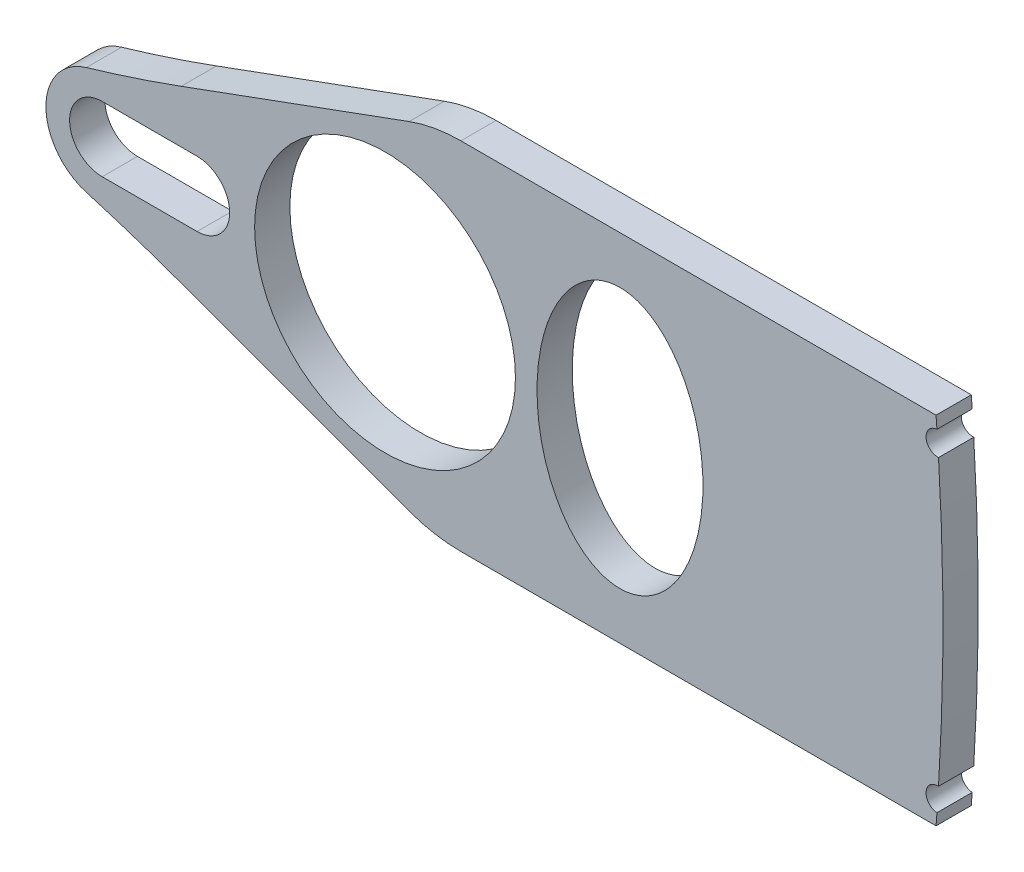
ISO-10303-21;
HEADER;
FILE_DESCRIPTION(('STEP AP214'),'2;1');
FILE_NAME('part.step','',(''),(''),'','','');
FILE_SCHEMA(('AUTOMOTIVE_DESIGN { 1 0 10303 214 1 1 1 1 }'));
ENDSEC;
DATA;
#1=APPLICATION_CONTEXT('core data for automotive mechanical design processes');
#2=APPLICATION_PROTOCOL_DEFINITION('international standard','automotive_design',2000,#1);
#3=PRODUCT_CONTEXT('',#1,'mechanical');
#4=PRODUCT('Part','Part','',(#3));
#5=PRODUCT_RELATED_PRODUCT_CATEGORY('part','',(#4));
#6=PRODUCT_DEFINITION_FORMATION('','',#4);
#7=PRODUCT_DEFINITION_CONTEXT('part definition',#1,'design');
#8=PRODUCT_DEFINITION('design','',#6,#7);
#9=PRODUCT_DEFINITION_SHAPE('','',#8);
#10=(LENGTH_UNIT() NAMED_UNIT(*) SI_UNIT(.MILLI.,.METRE.));
#11=(NAMED_UNIT(*) PLANE_ANGLE_UNIT() SI_UNIT($,.RADIAN.));
#12=(NAMED_UNIT(*) SI_UNIT($,.STERADIAN.) SOLID_ANGLE_UNIT());
#13=UNCERTAINTY_MEASURE_WITH_UNIT(LENGTH_MEASURE(1.E-05),#10,'distance_accuracy_value','');
#14=(GEOMETRIC_REPRESENTATION_CONTEXT(3) GLOBAL_UNCERTAINTY_ASSIGNED_CONTEXT((#13)) GLOBAL_UNIT_ASSIGNED_CONTEXT((#10,
#11,#12)) REPRESENTATION_CONTEXT('',''));
#15=CARTESIAN_POINT('',(0.,0.,0.));
#16=DIRECTION('',(0.,0.,1.));
#17=DIRECTION('',(1.,0.,0.));
#18=AXIS2_PLACEMENT_3D('',#15,#16,#17);
#19=CARTESIAN_POINT('',(-148.703303072536,-3.39173134022985E-11,3.));
#20=DIRECTION('',(0.,0.,1.));
#21=DIRECTION('',(1.,0.,0.));
#22=AXIS2_PLACEMENT_3D('',#19,#20,#21);
#23=PLANE('',#22);
#24=CARTESIAN_POINT('',(-0.545536149633069,0.,3.));
#25=DIRECTION('',(0.,0.,1.));
#26=DIRECTION('',(1.,0.,0.));
#27=AXIS2_PLACEMENT_3D('',#24,#25,#26);
#28=CIRCLE('',#27,11.101085899709);
#29=CARTESIAN_POINT('',(10.555549750076,0.,3.));
#30=VERTEX_POINT('',#29);
#31=EDGE_CURVE('E448',#30,#30,#28,.T.);
#32=ORIENTED_EDGE('',*,*,#31,.F.);
#33=EDGE_LOOP('',(#32));
#34=FACE_BOUND('',#33,.T.);
#35=DIRECTION('',(-1.,0.,0.));
#36=VECTOR('',#35,1.);
#37=CARTESIAN_POINT('',(28.8261972357437,15.1378444086942,3.));
#38=LINE('',#37,#36);
#39=CARTESIAN_POINT('',(46.3587127440423,15.1378444086954,3.));
#40=VERTEX_POINT('',#39);
#41=CARTESIAN_POINT('',(5.91044133032852,15.1378444086942,3.));
#42=VERTEX_POINT('',#41);
#43=EDGE_CURVE('E360',#40,#42,#38,.T.);
#44=ORIENTED_EDGE('',*,*,#43,.T.);
#45=CARTESIAN_POINT('',(5.9104413303358,2.32113614266628,3.));
#46=DIRECTION('',(0.,0.,1.));
#47=DIRECTION('',(1.,0.,0.));
#48=AXIS2_PLACEMENT_3D('',#45,#46,#47);
#49=CIRCLE('',#48,12.8167082660291);
#50=CARTESIAN_POINT('',(1.5045455670036,14.3567538376228,3.));
#51=VERTEX_POINT('',#50);
#52=EDGE_CURVE('E419',#42,#51,#49,.T.);
#53=ORIENTED_EDGE('',*,*,#52,.T.);
#54=DIRECTION('',(-0.939056850256716,-0.343761882683254,0.));
#55=VECTOR('',#54,1.);
#56=CARTESIAN_POINT('',(1.50454556700317,14.356753837624,3.));
#57=LINE('',#56,#55);
#58=CARTESIAN_POINT('',(-17.8942149727601,7.25542185431795,3.));
#59=VERTEX_POINT('',#58);
#60=EDGE_CURVE('E313',#51,#59,#57,.T.);
#61=ORIENTED_EDGE('',*,*,#60,.T.);
#62=CARTESIAN_POINT('',(-61.9531726061157,127.611598803856,3.));
#63=DIRECTION('',(0.,0.,-1.));
#64=DIRECTION('',(1.,0.,0.));
#65=AXIS2_PLACEMENT_3D('',#62,#63,#64);
#66=CIRCLE('',#65,128.167082660276);
#67=CARTESIAN_POINT('',(-25.9650650638667,4.60079767983473,3.));
#68=VERTEX_POINT('',#67);
#69=EDGE_CURVE('E409',#59,#68,#66,.T.);
#70=ORIENTED_EDGE('',*,*,#69,.T.);
#71=CARTESIAN_POINT('',(-24.6190531676033,-2.67272537154353E-12,3.));
#72=DIRECTION('',(0.,0.,1.));
#73=DIRECTION('',(1.,0.,0.));
#74=AXIS2_PLACEMENT_3D('',#71,#72,#73);
#75=CIRCLE('',#74,4.79365072941982);
#76=CARTESIAN_POINT('',(-25.9650650638678,-4.60079767983837,3.));
#77=VERTEX_POINT('',#76);
#78=EDGE_CURVE('E413',#68,#77,#75,.T.);
#79=ORIENTED_EDGE('',*,*,#78,.T.);
#80=CARTESIAN_POINT('',(-61.953172606039,-127.611598803884,3.));
#81=DIRECTION('',(0.,0.,-1.));
#82=DIRECTION('',(1.,0.,0.));
#83=AXIS2_PLACEMENT_3D('',#80,#81,#82);
#84=CIRCLE('',#83,128.167082660278);
#85=CARTESIAN_POINT('',(-17.8942149727582,-7.25542185431699,3.));
#86=VERTEX_POINT('',#85);
#87=EDGE_CURVE('E417',#77,#86,#84,.T.);
#88=ORIENTED_EDGE('',*,*,#87,.T.);
#89=DIRECTION('',(0.939056850256712,-0.343761882683264,0.));
#90=VECTOR('',#89,1.);
#91=CARTESIAN_POINT('',(-17.8942149727587,-7.25542185431823,3.));
#92=LINE('',#91,#90);
#93=CARTESIAN_POINT('',(1.50454556699025,-14.3567538376193,3.));
#94=VERTEX_POINT('',#93);
#95=EDGE_CURVE('E425',#86,#94,#92,.T.);
#96=ORIENTED_EDGE('',*,*,#95,.T.);
#97=CARTESIAN_POINT('',(5.91044133032117,-2.3211361426666,3.));
#98=DIRECTION('',(0.,0.,1.));
#99=DIRECTION('',(1.,0.,0.));
#100=AXIS2_PLACEMENT_3D('',#97,#98,#99);
#101=CIRCLE('',#100,12.8167082660263);
#102=CARTESIAN_POINT('',(5.91044133032854,-15.1378444086929,3.));
#103=VERTEX_POINT('',#102);
#104=EDGE_CURVE('E428',#94,#103,#101,.T.);
#105=ORIENTED_EDGE('',*,*,#104,.T.);
#106=DIRECTION('',(1.,0.,0.));
#107=VECTOR('',#106,1.);
#108=CARTESIAN_POINT('',(5.91044133032854,-15.1378444086942,3.));
#109=LINE('',#108,#107);
#110=CARTESIAN_POINT('',(46.3587127440441,-15.1378444086928,3.));
#111=VERTEX_POINT('',#110);
#112=EDGE_CURVE('E431',#103,#111,#109,.T.);
#113=ORIENTED_EDGE('',*,*,#112,.T.);
#114=CARTESIAN_POINT('',(-148.703303072536,1.32348559195306E-12,3.));
#115=DIRECTION('',(0.,0.,1.));
#116=DIRECTION('',(1.,0.,0.));
#117=AXIS2_PLACEMENT_3D('',#114,#115,#116);
#118=CIRCLE('',#117,195.64852247786);
#119=CARTESIAN_POINT('',(46.4342016571532,-14.131475352561,3.));
#120=VERTEX_POINT('',#119);
#121=EDGE_CURVE('E434',#111,#120,#118,.T.);
#122=ORIENTED_EDGE('',*,*,#121,.T.);
#123=CARTESIAN_POINT('',(46.5148800931519,-13.125515764054,3.));
#124=DIRECTION('',(0.,0.,-1.));
#125=DIRECTION('',(1.,0.,0.));
#126=AXIS2_PLACEMENT_3D('',#123,#124,#125);
#127=CIRCLE('',#126,1.00918962724761);
#128=CARTESIAN_POINT('',(46.5695906510489,-12.1178102224404,3.));
#129=VERTEX_POINT('',#128);
#130=EDGE_CURVE('E437',#120,#129,#127,.T.);
#131=ORIENTED_EDGE('',*,*,#130,.T.);
#132=CARTESIAN_POINT('',(-148.703303072536,-1.28011750505364E-12,3.));
#133=DIRECTION('',(0.,0.,1.));
#134=DIRECTION('',(1.,0.,0.));
#135=AXIS2_PLACEMENT_3D('',#132,#133,#134);
#136=CIRCLE('',#135,195.64852247786);
#137=CARTESIAN_POINT('',(46.5695906510489,12.1178102224377,3.));
#138=VERTEX_POINT('',#137);
#139=EDGE_CURVE('E440',#129,#138,#136,.T.);
#140=ORIENTED_EDGE('',*,*,#139,.T.);
#141=CARTESIAN_POINT('',(46.5148800931719,13.1255157640552,3.));
#142=DIRECTION('',(0.,0.,-1.));
#143=DIRECTION('',(1.,0.,0.));
#144=AXIS2_PLACEMENT_3D('',#141,#142,#143);
#145=CIRCLE('',#144,1.00918962725036);
#146=CARTESIAN_POINT('',(46.4342016571542,14.1314753525285,3.));
#147=VERTEX_POINT('',#146);
#148=EDGE_CURVE('E443',#138,#147,#145,.T.);
#149=ORIENTED_EDGE('',*,*,#148,.T.);
#150=CARTESIAN_POINT('',(-148.703303072536,-3.39173134022985E-11,3.));
#151=DIRECTION('',(0.,0.,1.));
#152=DIRECTION('',(1.,0.,0.));
#153=AXIS2_PLACEMENT_3D('',#150,#151,#152);
#154=CIRCLE('',#153,195.648522477861);
#155=EDGE_CURVE('E366',#147,#40,#154,.T.);
#156=ORIENTED_EDGE('',*,*,#155,.T.);
#157=EDGE_LOOP('',(#44,#53,#61,#70,#79,#88,#96,#105,#113,#122,#131,#140,#149,#156));
#158=FACE_BOUND('',#157,.T.);
#159=CARTESIAN_POINT('',(19.4544638503669,0.,3.));
#160=DIRECTION('',(0.,0.,1.));
#161=DIRECTION('',(0.,-1.,0.));
#162=AXIS2_PLACEMENT_3D('',#159,#160,#161);
#163=ELLIPSE('',#162,11.101085899709,7.06432739072393);
#164=CARTESIAN_POINT('',(19.454463850367,-11.1010858997089,3.));
#165=VERTEX_POINT('',#164);
#166=EDGE_CURVE('E219',#165,#165,#163,.T.);
#167=ORIENTED_EDGE('',*,*,#166,.F.);
#168=EDGE_LOOP('',(#167));
#169=FACE_BOUND('',#168,.T.);
#170=DIRECTION('',(-1.,0.,0.));
#171=VECTOR('',#170,1.);
#172=CARTESIAN_POINT('',(-24.6190531676033,2.77527147492737,3.));
#173=LINE('',#172,#171);
#174=CARTESIAN_POINT('',(-16.5455361496331,2.77527147492737,3.));
#175=VERTEX_POINT('',#174);
#176=CARTESIAN_POINT('',(-24.6190531676033,2.77527147492735,3.));
#177=VERTEX_POINT('',#176);
#178=EDGE_CURVE('E180',#175,#177,#173,.T.);
#179=ORIENTED_EDGE('',*,*,#178,.F.);
#180=CARTESIAN_POINT('',(-16.5455361496331,1.10154940724527E-13,3.));
#181=DIRECTION('',(0.,0.,1.));
#182=DIRECTION('',(1.,0.,0.));
#183=AXIS2_PLACEMENT_3D('',#180,#181,#182);
#184=CIRCLE('',#183,2.77527147492728);
#185=CARTESIAN_POINT('',(-16.5455361496331,-2.7752714749272,3.));
#186=VERTEX_POINT('',#185);
#187=EDGE_CURVE('E171',#186,#175,#184,.T.);
#188=ORIENTED_EDGE('',*,*,#187,.F.);
#189=DIRECTION('',(1.,0.,0.));
#190=VECTOR('',#189,1.);
#191=CARTESIAN_POINT('',(-16.5455361496331,-2.7752714749272,3.));
#192=LINE('',#191,#190);
#193=CARTESIAN_POINT('',(-24.6190531676033,-2.7752714749272,3.));
#194=VERTEX_POINT('',#193);
#195=EDGE_CURVE('E197',#194,#186,#192,.T.);
#196=ORIENTED_EDGE('',*,*,#195,.F.);
#197=CARTESIAN_POINT('',(-24.6190531676033,0.,3.));
#198=DIRECTION('',(0.,0.,1.));
#199=DIRECTION('',(1.,0.,0.));
#200=AXIS2_PLACEMENT_3D('',#197,#198,#199);
#201=CIRCLE('',#200,2.77527147492728);
#202=EDGE_CURVE('E193',#177,#194,#201,.T.);
#203=ORIENTED_EDGE('',*,*,#202,.F.);
#204=EDGE_LOOP('',(#179,#188,#196,#203));
#205=FACE_BOUND('',#204,.T.);
#206=ADVANCED_FACE('F45',(#34,#158,#169,#205),#23,.T.);
#207=CARTESIAN_POINT('',(-148.703303072536,-3.39173134022985E-11,0.));
#208=DIRECTION('',(0.,0.,1.));
#209=DIRECTION('',(1.,0.,0.));
#210=AXIS2_PLACEMENT_3D('',#207,#208,#209);
#211=PLANE('',#210);
#212=CARTESIAN_POINT('',(19.4544638503669,0.,0.));
#213=DIRECTION('',(0.,0.,1.));
#214=DIRECTION('',(0.,-1.,0.));
#215=AXIS2_PLACEMENT_3D('',#212,#213,#214);
#216=ELLIPSE('',#215,11.101085899709,7.06432739072393);
#217=CARTESIAN_POINT('',(19.454463850367,-11.1010858997089,0.));
#218=VERTEX_POINT('',#217);
#219=EDGE_CURVE('E189',#218,#218,#216,.T.);
#220=ORIENTED_EDGE('',*,*,#219,.T.);
#221=EDGE_LOOP('',(#220));
#222=FACE_BOUND('',#221,.T.);
#223=CARTESIAN_POINT('',(-0.545536149633069,0.,0.));
#224=DIRECTION('',(0.,0.,1.));
#225=DIRECTION('',(1.,0.,0.));
#226=AXIS2_PLACEMENT_3D('',#223,#224,#225);
#227=CIRCLE('',#226,11.101085899709);
#228=CARTESIAN_POINT('',(10.555549750076,0.,0.));
#229=VERTEX_POINT('',#228);
#230=EDGE_CURVE('E224',#229,#229,#227,.T.);
#231=ORIENTED_EDGE('',*,*,#230,.T.);
#232=EDGE_LOOP('',(#231));
#233=FACE_BOUND('',#232,.T.);
#234=DIRECTION('',(-1.,0.,0.));
#235=VECTOR('',#234,1.);
#236=CARTESIAN_POINT('',(28.8261972357437,15.1378444086942,0.));
#237=LINE('',#236,#235);
#238=CARTESIAN_POINT('',(46.3587127440423,15.1378444086954,0.));
#239=VERTEX_POINT('',#238);
#240=CARTESIAN_POINT('',(5.91044133032852,15.1378444086942,0.));
#241=VERTEX_POINT('',#240);
#242=EDGE_CURVE('E309',#239,#241,#237,.T.);
#243=ORIENTED_EDGE('',*,*,#242,.F.);
#244=CARTESIAN_POINT('',(-148.703303072536,-3.39173134022985E-11,0.));
#245=DIRECTION('',(0.,0.,1.));
#246=DIRECTION('',(1.,0.,0.));
#247=AXIS2_PLACEMENT_3D('',#244,#245,#246);
#248=CIRCLE('',#247,195.648522477861);
#249=CARTESIAN_POINT('',(46.4342016571542,14.1314753525285,0.));
#250=VERTEX_POINT('',#249);
#251=EDGE_CURVE('E356',#250,#239,#248,.T.);
#252=ORIENTED_EDGE('',*,*,#251,.F.);
#253=CARTESIAN_POINT('',(46.5148800931626,13.1255157640223,0.));
#254=DIRECTION('',(0.,0.,-1.));
#255=DIRECTION('',(1.,0.,0.));
#256=AXIS2_PLACEMENT_3D('',#253,#254,#255);
#257=CIRCLE('',#256,1.00918962724769);
#258=CARTESIAN_POINT('',(46.5695906510489,12.1178102224377,0.));
#259=VERTEX_POINT('',#258);
#260=EDGE_CURVE('E353',#259,#250,#257,.T.);
#261=ORIENTED_EDGE('',*,*,#260,.F.);
#262=CARTESIAN_POINT('',(-148.703303072536,-1.28011750505364E-12,0.));
#263=DIRECTION('',(0.,0.,1.));
#264=DIRECTION('',(1.,0.,0.));
#265=AXIS2_PLACEMENT_3D('',#262,#263,#264);
#266=CIRCLE('',#265,195.64852247786);
#267=CARTESIAN_POINT('',(46.5695906510489,-12.1178102224404,0.));
#268=VERTEX_POINT('',#267);
#269=EDGE_CURVE('E349',#268,#259,#266,.T.);
#270=ORIENTED_EDGE('',*,*,#269,.F.);
#271=CARTESIAN_POINT('',(46.5148800931519,-13.125515764054,0.));
#272=DIRECTION('',(0.,0.,-1.));
#273=DIRECTION('',(1.,0.,0.));
#274=AXIS2_PLACEMENT_3D('',#271,#272,#273);
#275=CIRCLE('',#274,1.00918962724762);
#276=CARTESIAN_POINT('',(46.4342016571532,-14.131475352561,0.));
#277=VERTEX_POINT('',#276);
#278=EDGE_CURVE('E346',#277,#268,#275,.T.);
#279=ORIENTED_EDGE('',*,*,#278,.F.);
#280=CARTESIAN_POINT('',(-148.703303072536,1.32348559195306E-12,0.));
#281=DIRECTION('',(0.,0.,1.));
#282=DIRECTION('',(1.,0.,0.));
#283=AXIS2_PLACEMENT_3D('',#280,#281,#282);
#284=CIRCLE('',#283,195.64852247786);
#285=CARTESIAN_POINT('',(46.3587127440441,-15.1378444086928,0.));
#286=VERTEX_POINT('',#285);
#287=EDGE_CURVE('E342',#286,#277,#284,.T.);
#288=ORIENTED_EDGE('',*,*,#287,.F.);
#289=DIRECTION('',(1.,0.,0.));
#290=VECTOR('',#289,1.);
#291=CARTESIAN_POINT('',(28.8261972357436,-15.1378444086942,0.));
#292=LINE('',#291,#290);
#293=CARTESIAN_POINT('',(5.91044133032854,-15.1378444086929,0.));
#294=VERTEX_POINT('',#293);
#295=EDGE_CURVE('E339',#294,#286,#292,.T.);
#296=ORIENTED_EDGE('',*,*,#295,.F.);
#297=CARTESIAN_POINT('',(5.91044133032117,-2.3211361426666,0.));
#298=DIRECTION('',(0.,0.,1.));
#299=DIRECTION('',(1.,0.,0.));
#300=AXIS2_PLACEMENT_3D('',#297,#298,#299);
#301=CIRCLE('',#300,12.8167082660263);
#302=CARTESIAN_POINT('',(1.50454556699025,-14.3567538376193,0.));
#303=VERTEX_POINT('',#302);
#304=EDGE_CURVE('E335',#303,#294,#301,.T.);
#305=ORIENTED_EDGE('',*,*,#304,.F.);
#306=DIRECTION('',(0.939056850256712,-0.343761882683264,0.));
#307=VECTOR('',#306,1.);
#308=CARTESIAN_POINT('',(-17.8942149727587,-7.25542185431823,0.));
#309=LINE('',#308,#307);
#310=CARTESIAN_POINT('',(-17.8942149727582,-7.25542185431699,0.));
#311=VERTEX_POINT('',#310);
#312=EDGE_CURVE('E332',#311,#303,#309,.T.);
#313=ORIENTED_EDGE('',*,*,#312,.F.);
#314=CARTESIAN_POINT('',(-61.953172606039,-127.611598803884,0.));
#315=DIRECTION('',(0.,0.,-1.));
#316=DIRECTION('',(1.,0.,0.));
#317=AXIS2_PLACEMENT_3D('',#314,#315,#316);
#318=CIRCLE('',#317,128.167082660278);
#319=CARTESIAN_POINT('',(-25.9650650638678,-4.60079767983837,0.));
#320=VERTEX_POINT('',#319);
#321=EDGE_CURVE('E329',#320,#311,#318,.T.);
#322=ORIENTED_EDGE('',*,*,#321,.F.);
#323=CARTESIAN_POINT('',(-24.6190531676033,-2.67272537154353E-12,0.));
#324=DIRECTION('',(0.,0.,1.));
#325=DIRECTION('',(1.,0.,0.));
#326=AXIS2_PLACEMENT_3D('',#323,#324,#325);
#327=CIRCLE('',#326,4.79365072941982);
#328=CARTESIAN_POINT('',(-25.9650650638667,4.60079767983473,0.));
#329=VERTEX_POINT('',#328);
#330=EDGE_CURVE('E323',#329,#320,#327,.T.);
#331=ORIENTED_EDGE('',*,*,#330,.F.);
#332=CARTESIAN_POINT('',(-61.9531726061157,127.611598803856,0.));
#333=DIRECTION('',(0.,0.,-1.));
#334=DIRECTION('',(1.,0.,0.));
#335=AXIS2_PLACEMENT_3D('',#332,#333,#334);
#336=CIRCLE('',#335,128.167082660276);
#337=CARTESIAN_POINT('',(-17.8942149727601,7.25542185431795,0.));
#338=VERTEX_POINT('',#337);
#339=EDGE_CURVE('E319',#338,#329,#336,.T.);
#340=ORIENTED_EDGE('',*,*,#339,.F.);
#341=DIRECTION('',(-0.939056850256716,-0.343761882683254,0.));
#342=VECTOR('',#341,1.);
#343=CARTESIAN_POINT('',(1.50454556700317,14.356753837624,0.));
#344=LINE('',#343,#342);
#345=CARTESIAN_POINT('',(1.5045455670036,14.3567538376228,0.));
#346=VERTEX_POINT('',#345);
#347=EDGE_CURVE('E308',#346,#338,#344,.T.);
#348=ORIENTED_EDGE('',*,*,#347,.F.);
#349=CARTESIAN_POINT('',(5.9104413303358,2.32113614266628,0.));
#350=DIRECTION('',(0.,0.,1.));
#351=DIRECTION('',(1.,0.,0.));
#352=AXIS2_PLACEMENT_3D('',#349,#350,#351);
#353=CIRCLE('',#352,12.8167082660291);
#354=EDGE_CURVE('E300',#241,#346,#353,.T.);
#355=ORIENTED_EDGE('',*,*,#354,.F.);
#356=EDGE_LOOP('',(#243,#252,#261,#270,#279,#288,#296,#305,#313,#322,#331,#340,#348,#355));
#357=FACE_BOUND('',#356,.T.);
#358=CARTESIAN_POINT('',(-16.5455361496331,1.10154940724527E-13,0.));
#359=DIRECTION('',(0.,0.,1.));
#360=DIRECTION('',(1.,0.,0.));
#361=AXIS2_PLACEMENT_3D('',#358,#359,#360);
#362=CIRCLE('',#361,2.77527147492728);
#363=CARTESIAN_POINT('',(-16.5455361496331,-2.7752714749272,0.));
#364=VERTEX_POINT('',#363);
#365=CARTESIAN_POINT('',(-16.5455361496331,2.77527147492737,0.));
#366=VERTEX_POINT('',#365);
#367=EDGE_CURVE('E69',#364,#366,#362,.T.);
#368=ORIENTED_EDGE('',*,*,#367,.T.);
#369=DIRECTION('',(-1.,0.,0.));
#370=VECTOR('',#369,1.);
#371=CARTESIAN_POINT('',(-24.6190531676033,2.77527147492737,0.));
#372=LINE('',#371,#370);
#373=CARTESIAN_POINT('',(-24.6190531676033,2.77527147492735,0.));
#374=VERTEX_POINT('',#373);
#375=EDGE_CURVE('E187',#366,#374,#372,.T.);
#376=ORIENTED_EDGE('',*,*,#375,.T.);
#377=CARTESIAN_POINT('',(-24.6190531676033,0.,0.));
#378=DIRECTION('',(0.,0.,1.));
#379=DIRECTION('',(1.,0.,0.));
#380=AXIS2_PLACEMENT_3D('',#377,#378,#379);
#381=CIRCLE('',#380,2.77527147492728);
#382=CARTESIAN_POINT('',(-24.6190531676033,-2.7752714749272,0.));
#383=VERTEX_POINT('',#382);
#384=EDGE_CURVE('E206',#374,#383,#381,.T.);
#385=ORIENTED_EDGE('',*,*,#384,.T.);
#386=DIRECTION('',(1.,0.,0.));
#387=VECTOR('',#386,1.);
#388=CARTESIAN_POINT('',(-16.5455361496331,-2.7752714749272,0.));
#389=LINE('',#388,#387);
#390=EDGE_CURVE('E181',#383,#364,#389,.T.);
#391=ORIENTED_EDGE('',*,*,#390,.T.);
#392=EDGE_LOOP('',(#368,#376,#385,#391));
#393=FACE_BOUND('',#392,.T.);
#394=ADVANCED_FACE('F240',(#222,#233,#357,#393),#211,.F.);
#395=CARTESIAN_POINT('',(28.8261972357437,15.1378444086942,3.));
#396=DIRECTION('',(0.,-1.,0.));
#397=DIRECTION('',(0.,0.,-1.));
#398=AXIS2_PLACEMENT_3D('',#395,#396,#397);
#399=PLANE('',#398);
#400=ORIENTED_EDGE('',*,*,#242,.T.);
#401=DIRECTION('',(0.,0.,-1.));
#402=VECTOR('',#401,1.);
#403=CARTESIAN_POINT('',(5.91044133032852,15.1378444086942,3.));
#404=LINE('',#403,#402);
#405=EDGE_CURVE('E11',#42,#241,#404,.T.);
#406=ORIENTED_EDGE('',*,*,#405,.F.);
#407=ORIENTED_EDGE('',*,*,#43,.F.);
#408=DIRECTION('',(0.,0.,-1.));
#409=VECTOR('',#408,1.);
#410=CARTESIAN_POINT('',(46.3587127440423,15.1378444086954,3.));
#411=LINE('',#410,#409);
#412=EDGE_CURVE('E361',#40,#239,#411,.T.);
#413=ORIENTED_EDGE('',*,*,#412,.T.);
#414=EDGE_LOOP('',(#400,#406,#407,#413));
#415=FACE_BOUND('',#414,.T.);
#416=ADVANCED_FACE('F47',(#415),#399,.F.);
#417=CARTESIAN_POINT('',(5.9104413303358,2.32113614266628,3.));
#418=DIRECTION('',(0.,0.,-1.));
#419=DIRECTION('',(-1.,0.,0.));
#420=AXIS2_PLACEMENT_3D('',#417,#418,#419);
#421=CYLINDRICAL_SURFACE('',#420,12.8167082660291);
#422=ORIENTED_EDGE('',*,*,#354,.T.);
#423=DIRECTION('',(0.,0.,-1.));
#424=VECTOR('',#423,1.);
#425=CARTESIAN_POINT('',(1.5045455670036,14.3567538376228,3.));
#426=LINE('',#425,#424);
#427=EDGE_CURVE('E54',#51,#346,#426,.T.);
#428=ORIENTED_EDGE('',*,*,#427,.F.);
#429=ORIENTED_EDGE('',*,*,#52,.F.);
#430=ORIENTED_EDGE('',*,*,#405,.T.);
#431=EDGE_LOOP('',(#422,#428,#429,#430));
#432=FACE_BOUND('',#431,.T.);
#433=ADVANCED_FACE('F290',(#432),#421,.T.);
#434=CARTESIAN_POINT('',(1.50454556700317,14.356753837624,3.));
#435=DIRECTION('',(0.343761882683254,-0.939056850256716,0.));
#436=DIRECTION('',(0.939056850256716,0.343761882683254,0.));
#437=AXIS2_PLACEMENT_3D('',#434,#435,#436);
#438=PLANE('',#437);
#439=ORIENTED_EDGE('',*,*,#347,.T.);
#440=DIRECTION('',(0.,0.,-1.));
#441=VECTOR('',#440,1.);
#442=CARTESIAN_POINT('',(-17.8942149727601,7.25542185431795,3.));
#443=LINE('',#442,#441);
#444=EDGE_CURVE('E315',#59,#338,#443,.T.);
#445=ORIENTED_EDGE('',*,*,#444,.F.);
#446=ORIENTED_EDGE('',*,*,#60,.F.);
#447=ORIENTED_EDGE('',*,*,#427,.T.);
#448=EDGE_LOOP('',(#439,#445,#446,#447));
#449=FACE_BOUND('',#448,.T.);
#450=ADVANCED_FACE('F287',(#449),#438,.F.);
#451=CARTESIAN_POINT('',(-61.9531726061157,127.611598803856,3.));
#452=DIRECTION('',(0.,0.,-1.));
#453=DIRECTION('',(-1.,0.,0.));
#454=AXIS2_PLACEMENT_3D('',#451,#452,#453);
#455=CYLINDRICAL_SURFACE('',#454,128.167082660276);
#456=ORIENTED_EDGE('',*,*,#339,.T.);
#457=DIRECTION('',(0.,0.,-1.));
#458=VECTOR('',#457,1.);
#459=CARTESIAN_POINT('',(-25.9650650638667,4.60079767983473,3.));
#460=LINE('',#459,#458);
#461=EDGE_CURVE('E402',#68,#329,#460,.T.);
#462=ORIENTED_EDGE('',*,*,#461,.F.);
#463=ORIENTED_EDGE('',*,*,#69,.F.);
#464=ORIENTED_EDGE('',*,*,#444,.T.);
#465=EDGE_LOOP('',(#456,#462,#463,#464));
#466=FACE_BOUND('',#465,.T.);
#467=ADVANCED_FACE('F283',(#466),#455,.F.);
#468=CARTESIAN_POINT('',(-24.6190531676033,-2.67272537154353E-12,3.));
#469=DIRECTION('',(0.,0.,-1.));
#470=DIRECTION('',(-1.,0.,0.));
#471=AXIS2_PLACEMENT_3D('',#468,#469,#470);
#472=CYLINDRICAL_SURFACE('',#471,4.79365072941982);
#473=ORIENTED_EDGE('',*,*,#330,.T.);
#474=DIRECTION('',(0.,0.,-1.));
#475=VECTOR('',#474,1.);
#476=CARTESIAN_POINT('',(-25.9650650638678,-4.60079767983837,3.));
#477=LINE('',#476,#475);
#478=EDGE_CURVE('E398',#77,#320,#477,.T.);
#479=ORIENTED_EDGE('',*,*,#478,.F.);
#480=ORIENTED_EDGE('',*,*,#78,.F.);
#481=ORIENTED_EDGE('',*,*,#461,.T.);
#482=EDGE_LOOP('',(#473,#479,#480,#481));
#483=FACE_BOUND('',#482,.T.);
#484=ADVANCED_FACE('F279',(#483),#472,.T.);
#485=CARTESIAN_POINT('',(-61.953172606039,-127.611598803884,3.));
#486=DIRECTION('',(0.,0.,-1.));
#487=DIRECTION('',(-1.,0.,0.));
#488=AXIS2_PLACEMENT_3D('',#485,#486,#487);
#489=CYLINDRICAL_SURFACE('',#488,128.167082660278);
#490=ORIENTED_EDGE('',*,*,#321,.T.);
#491=DIRECTION('',(0.,0.,-1.));
#492=VECTOR('',#491,1.);
#493=CARTESIAN_POINT('',(-17.8942149727582,-7.25542185431699,3.));
#494=LINE('',#493,#492);
#495=EDGE_CURVE('E394',#86,#311,#494,.T.);
#496=ORIENTED_EDGE('',*,*,#495,.F.);
#497=ORIENTED_EDGE('',*,*,#87,.F.);
#498=ORIENTED_EDGE('',*,*,#478,.T.);
#499=EDGE_LOOP('',(#490,#496,#497,#498));
#500=FACE_BOUND('',#499,.T.);
#501=ADVANCED_FACE('F275',(#500),#489,.F.);
#502=CARTESIAN_POINT('',(-17.8942149727587,-7.25542185431823,3.));
#503=DIRECTION('',(0.343761882683264,0.939056850256712,0.));
#504=DIRECTION('',(-0.939056850256713,0.343761882683264,0.));
#505=AXIS2_PLACEMENT_3D('',#502,#503,#504);
#506=PLANE('',#505);
#507=ORIENTED_EDGE('',*,*,#312,.T.);
#508=DIRECTION('',(0.,0.,-1.));
#509=VECTOR('',#508,1.);
#510=CARTESIAN_POINT('',(1.50454556699025,-14.3567538376193,3.));
#511=LINE('',#510,#509);
#512=EDGE_CURVE('E390',#94,#303,#511,.T.);
#513=ORIENTED_EDGE('',*,*,#512,.F.);
#514=ORIENTED_EDGE('',*,*,#95,.F.);
#515=ORIENTED_EDGE('',*,*,#495,.T.);
#516=EDGE_LOOP('',(#507,#513,#514,#515));
#517=FACE_BOUND('',#516,.T.);
#518=ADVANCED_FACE('F271',(#517),#506,.F.);
#519=CARTESIAN_POINT('',(5.91044133032117,-2.3211361426666,3.));
#520=DIRECTION('',(0.,0.,-1.));
#521=DIRECTION('',(-1.,0.,0.));
#522=AXIS2_PLACEMENT_3D('',#519,#520,#521);
#523=CYLINDRICAL_SURFACE('',#522,12.8167082660263);
#524=ORIENTED_EDGE('',*,*,#304,.T.);
#525=DIRECTION('',(0.,0.,-1.));
#526=VECTOR('',#525,1.);
#527=CARTESIAN_POINT('',(5.91044133032854,-15.1378444086929,3.));
#528=LINE('',#527,#526);
#529=EDGE_CURVE('E386',#103,#294,#528,.T.);
#530=ORIENTED_EDGE('',*,*,#529,.F.);
#531=ORIENTED_EDGE('',*,*,#104,.F.);
#532=ORIENTED_EDGE('',*,*,#512,.T.);
#533=EDGE_LOOP('',(#524,#530,#531,#532));
#534=FACE_BOUND('',#533,.T.);
#535=ADVANCED_FACE('F267',(#534),#523,.T.);
#536=CARTESIAN_POINT('',(28.8261972357436,-15.1378444086942,3.));
#537=DIRECTION('',(0.,1.,0.));
#538=DIRECTION('',(-1.,0.,0.));
#539=AXIS2_PLACEMENT_3D('',#536,#537,#538);
#540=PLANE('',#539);
#541=ORIENTED_EDGE('',*,*,#295,.T.);
#542=DIRECTION('',(0.,0.,-1.));
#543=VECTOR('',#542,1.);
#544=CARTESIAN_POINT('',(46.3587127440441,-15.1378444086928,3.));
#545=LINE('',#544,#543);
#546=EDGE_CURVE('E382',#111,#286,#545,.T.);
#547=ORIENTED_EDGE('',*,*,#546,.F.);
#548=ORIENTED_EDGE('',*,*,#112,.F.);
#549=ORIENTED_EDGE('',*,*,#529,.T.);
#550=EDGE_LOOP('',(#541,#547,#548,#549));
#551=FACE_BOUND('',#550,.T.);
#552=ADVANCED_FACE('F263',(#551),#540,.F.);
#553=CARTESIAN_POINT('',(-148.703303072536,1.32348559195306E-12,3.));
#554=DIRECTION('',(0.,0.,-1.));
#555=DIRECTION('',(-1.,0.,0.));
#556=AXIS2_PLACEMENT_3D('',#553,#554,#555);
#557=CYLINDRICAL_SURFACE('',#556,195.64852247786);
#558=ORIENTED_EDGE('',*,*,#287,.T.);
#559=DIRECTION('',(0.,0.,-1.));
#560=VECTOR('',#559,1.);
#561=CARTESIAN_POINT('',(46.4342016571532,-14.131475352561,3.));
#562=LINE('',#561,#560);
#563=EDGE_CURVE('E378',#120,#277,#562,.T.);
#564=ORIENTED_EDGE('',*,*,#563,.F.);
#565=ORIENTED_EDGE('',*,*,#121,.F.);
#566=ORIENTED_EDGE('',*,*,#546,.T.);
#567=EDGE_LOOP('',(#558,#564,#565,#566));
#568=FACE_BOUND('',#567,.T.);
#569=ADVANCED_FACE('F259',(#568),#557,.T.);
#570=CARTESIAN_POINT('',(46.5148800931519,-13.125515764054,3.));
#571=DIRECTION('',(0.,0.,-1.));
#572=DIRECTION('',(-1.,0.,0.));
#573=AXIS2_PLACEMENT_3D('',#570,#571,#572);
#574=CYLINDRICAL_SURFACE('',#573,1.00918962724762);
#575=ORIENTED_EDGE('',*,*,#278,.T.);
#576=DIRECTION('',(0.,0.,-1.));
#577=VECTOR('',#576,1.);
#578=CARTESIAN_POINT('',(46.5695906510489,-12.1178102224404,3.));
#579=LINE('',#578,#577);
#580=EDGE_CURVE('E374',#129,#268,#579,.T.);
#581=ORIENTED_EDGE('',*,*,#580,.F.);
#582=ORIENTED_EDGE('',*,*,#130,.F.);
#583=ORIENTED_EDGE('',*,*,#563,.T.);
#584=EDGE_LOOP('',(#575,#581,#582,#583));
#585=FACE_BOUND('',#584,.T.);
#586=ADVANCED_FACE('F255',(#585),#574,.F.);
#587=CARTESIAN_POINT('',(-148.703303072536,-1.28011750505364E-12,3.));
#588=DIRECTION('',(0.,0.,-1.));
#589=DIRECTION('',(-1.,0.,0.));
#590=AXIS2_PLACEMENT_3D('',#587,#588,#589);
#591=CYLINDRICAL_SURFACE('',#590,195.64852247786);
#592=ORIENTED_EDGE('',*,*,#269,.T.);
#593=DIRECTION('',(0.,0.,-1.));
#594=VECTOR('',#593,1.);
#595=CARTESIAN_POINT('',(46.5695906510489,12.1178102224377,3.));
#596=LINE('',#595,#594);
#597=EDGE_CURVE('E370',#138,#259,#596,.T.);
#598=ORIENTED_EDGE('',*,*,#597,.F.);
#599=ORIENTED_EDGE('',*,*,#139,.F.);
#600=ORIENTED_EDGE('',*,*,#580,.T.);
#601=EDGE_LOOP('',(#592,#598,#599,#600));
#602=FACE_BOUND('',#601,.T.);
#603=ADVANCED_FACE('F251',(#602),#591,.T.);
#604=CARTESIAN_POINT('',(46.5148800931626,13.1255157640223,3.));
#605=DIRECTION('',(0.,0.,-1.));
#606=DIRECTION('',(-1.,0.,0.));
#607=AXIS2_PLACEMENT_3D('',#604,#605,#606);
#608=CYLINDRICAL_SURFACE('',#607,1.00918962724769);
#609=ORIENTED_EDGE('',*,*,#260,.T.);
#610=DIRECTION('',(0.,0.,-1.));
#611=VECTOR('',#610,1.);
#612=CARTESIAN_POINT('',(46.4342016571542,14.1314753525285,3.));
#613=LINE('',#612,#611);
#614=EDGE_CURVE('E365',#147,#250,#613,.T.);
#615=ORIENTED_EDGE('',*,*,#614,.F.);
#616=ORIENTED_EDGE('',*,*,#148,.F.);
#617=ORIENTED_EDGE('',*,*,#597,.T.);
#618=EDGE_LOOP('',(#609,#615,#616,#617));
#619=FACE_BOUND('',#618,.T.);
#620=ADVANCED_FACE('F247',(#619),#608,.F.);
#621=CARTESIAN_POINT('',(-148.703303072536,-3.39173134022985E-11,3.));
#622=DIRECTION('',(0.,0.,-1.));
#623=DIRECTION('',(-1.,0.,0.));
#624=AXIS2_PLACEMENT_3D('',#621,#622,#623);
#625=CYLINDRICAL_SURFACE('',#624,195.648522477861);
#626=ORIENTED_EDGE('',*,*,#251,.T.);
#627=ORIENTED_EDGE('',*,*,#412,.F.);
#628=ORIENTED_EDGE('',*,*,#155,.F.);
#629=ORIENTED_EDGE('',*,*,#614,.T.);
#630=EDGE_LOOP('',(#626,#627,#628,#629));
#631=FACE_BOUND('',#630,.T.);
#632=ADVANCED_FACE('F236',(#631),#625,.T.);
#633=CARTESIAN_POINT('',(-0.545536149633069,0.,3.));
#634=DIRECTION('',(0.,0.,-1.));
#635=DIRECTION('',(-1.,0.,0.));
#636=AXIS2_PLACEMENT_3D('',#633,#634,#635);
#637=CYLINDRICAL_SURFACE('',#636,11.101085899709);
#638=ORIENTED_EDGE('',*,*,#31,.T.);
#639=EDGE_LOOP('',(#638));
#640=FACE_BOUND('',#639,.T.);
#641=ORIENTED_EDGE('',*,*,#230,.F.);
#642=EDGE_LOOP('',(#641));
#643=FACE_BOUND('',#642,.T.);
#644=ADVANCED_FACE('F231',(#640,#643),#637,.F.);
#645=DIRECTION('',(0.,0.,-1.));
#646=VECTOR('',#645,1.);
#647=SURFACE_OF_LINEAR_EXTRUSION('',#163,#646);
#648=ORIENTED_EDGE('',*,*,#166,.T.);
#649=EDGE_LOOP('',(#648));
#650=FACE_BOUND('',#649,.T.);
#651=ORIENTED_EDGE('',*,*,#219,.F.);
#652=EDGE_LOOP('',(#651));
#653=FACE_BOUND('',#652,.T.);
#654=ADVANCED_FACE('F227',(#650,#653),#647,.T.);
#655=CARTESIAN_POINT('',(-16.5455361496331,1.10154940724527E-13,3.));
#656=DIRECTION('',(0.,0.,-1.));
#657=DIRECTION('',(-1.,0.,0.));
#658=AXIS2_PLACEMENT_3D('',#655,#656,#657);
#659=CYLINDRICAL_SURFACE('',#658,2.77527147492728);
#660=ORIENTED_EDGE('',*,*,#367,.F.);
#661=DIRECTION('',(0.,0.,-1.));
#662=VECTOR('',#661,1.);
#663=CARTESIAN_POINT('',(-16.5455361496331,-2.7752714749272,3.));
#664=LINE('',#663,#662);
#665=EDGE_CURVE('E175',#186,#364,#664,.T.);
#666=ORIENTED_EDGE('',*,*,#665,.F.);
#667=ORIENTED_EDGE('',*,*,#187,.T.);
#668=DIRECTION('',(0.,0.,-1.));
#669=VECTOR('',#668,1.);
#670=CARTESIAN_POINT('',(-16.5455361496331,2.77527147492737,3.));
#671=LINE('',#670,#669);
#672=EDGE_CURVE('E174',#175,#366,#671,.T.);
#673=ORIENTED_EDGE('',*,*,#672,.T.);
#674=EDGE_LOOP('',(#660,#666,#667,#673));
#675=FACE_BOUND('',#674,.T.);
#676=ADVANCED_FACE('F173',(#675),#659,.F.);
#677=CARTESIAN_POINT('',(-24.6190531676033,2.77527147492737,3.));
#678=DIRECTION('',(0.,-1.,0.));
#679=DIRECTION('',(0.,0.,-1.));
#680=AXIS2_PLACEMENT_3D('',#677,#678,#679);
#681=PLANE('',#680);
#682=ORIENTED_EDGE('',*,*,#375,.F.);
#683=ORIENTED_EDGE('',*,*,#672,.F.);
#684=ORIENTED_EDGE('',*,*,#178,.T.);
#685=DIRECTION('',(0.,0.,-1.));
#686=VECTOR('',#685,1.);
#687=CARTESIAN_POINT('',(-24.6190531676033,2.77527147492735,3.));
#688=LINE('',#687,#686);
#689=EDGE_CURVE('E190',#177,#374,#688,.T.);
#690=ORIENTED_EDGE('',*,*,#689,.T.);
#691=EDGE_LOOP('',(#682,#683,#684,#690));
#692=FACE_BOUND('',#691,.T.);
#693=ADVANCED_FACE('F184',(#692),#681,.T.);
#694=CARTESIAN_POINT('',(-24.6190531676033,0.,3.));
#695=DIRECTION('',(0.,0.,-1.));
#696=DIRECTION('',(-1.,0.,0.));
#697=AXIS2_PLACEMENT_3D('',#694,#695,#696);
#698=CYLINDRICAL_SURFACE('',#697,2.77527147492728);
#699=ORIENTED_EDGE('',*,*,#384,.F.);
#700=ORIENTED_EDGE('',*,*,#689,.F.);
#701=ORIENTED_EDGE('',*,*,#202,.T.);
#702=DIRECTION('',(0.,0.,-1.));
#703=VECTOR('',#702,1.);
#704=CARTESIAN_POINT('',(-24.6190531676033,-2.7752714749272,3.));
#705=LINE('',#704,#703);
#706=EDGE_CURVE('E61',#194,#383,#705,.T.);
#707=ORIENTED_EDGE('',*,*,#706,.T.);
#708=EDGE_LOOP('',(#699,#700,#701,#707));
#709=FACE_BOUND('',#708,.T.);
#710=ADVANCED_FACE('F496',(#709),#698,.F.);
#711=CARTESIAN_POINT('',(-16.5455361496331,-2.7752714749272,3.));
#712=DIRECTION('',(0.,1.,0.));
#713=DIRECTION('',(0.,0.,1.));
#714=AXIS2_PLACEMENT_3D('',#711,#712,#713);
#715=PLANE('',#714);
#716=ORIENTED_EDGE('',*,*,#390,.F.);
#717=ORIENTED_EDGE('',*,*,#706,.F.);
#718=ORIENTED_EDGE('',*,*,#195,.T.);
#719=ORIENTED_EDGE('',*,*,#665,.T.);
#720=EDGE_LOOP('',(#716,#717,#718,#719));
#721=FACE_BOUND('',#720,.T.);
#722=ADVANCED_FACE('F494',(#721),#715,.T.);
#723=CLOSED_SHELL('',(#206,#394,#416,#433,#450,#467,#484,#501,#518,#535,#552,#569,#586,#603,
#620,#632,#644,#654,#676,#693,#710,#722));
#724=MANIFOLD_SOLID_BREP('B2',#723);
#725=ADVANCED_BREP_SHAPE_REPRESENTATION('',(#18,#724),#14);
#726=SHAPE_DEFINITION_REPRESENTATION(#9,#725);
ENDSEC;
END-ISO-10303-21;
